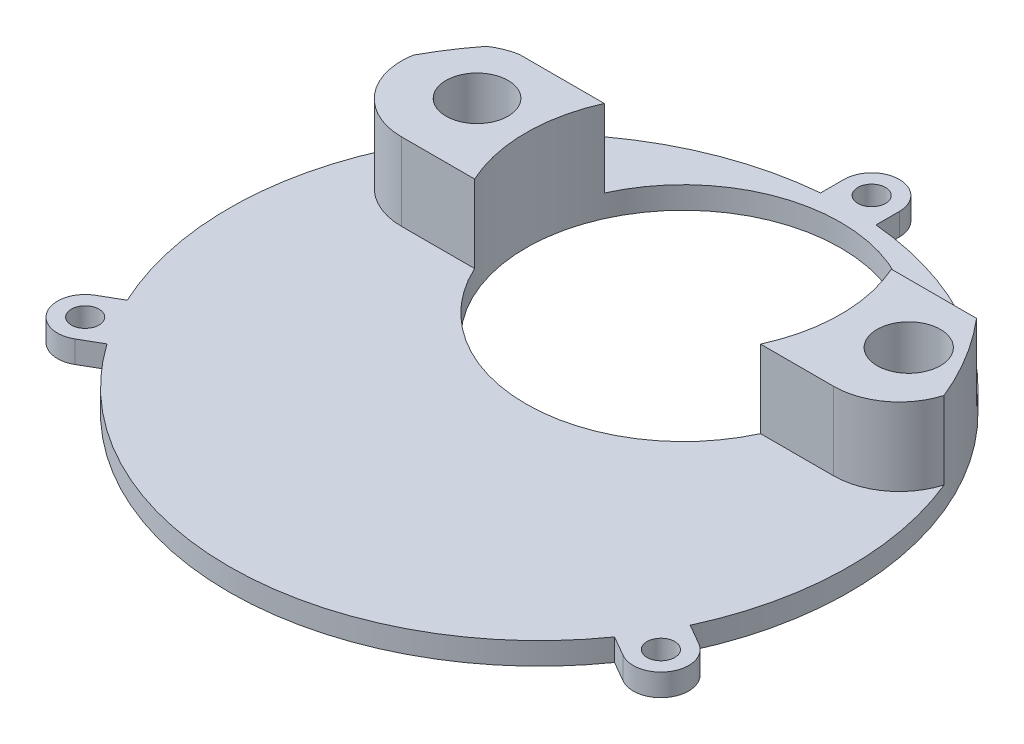
ISO-10303-21;
HEADER;
FILE_DESCRIPTION(('STEP AP214'),'2;1');
FILE_NAME('part.step','',(''),(''),'','','');
FILE_SCHEMA(('AUTOMOTIVE_DESIGN { 1 0 10303 214 1 1 1 1 }'));
ENDSEC;
DATA;
#1=APPLICATION_CONTEXT('core data for automotive mechanical design processes');
#2=APPLICATION_PROTOCOL_DEFINITION('international standard','automotive_design',2000,#1);
#3=PRODUCT_CONTEXT('',#1,'mechanical');
#4=PRODUCT('Part','Part','',(#3));
#5=PRODUCT_RELATED_PRODUCT_CATEGORY('part','',(#4));
#6=PRODUCT_DEFINITION_FORMATION('','',#4);
#7=PRODUCT_DEFINITION_CONTEXT('part definition',#1,'design');
#8=PRODUCT_DEFINITION('design','',#6,#7);
#9=PRODUCT_DEFINITION_SHAPE('','',#8);
#10=(LENGTH_UNIT() NAMED_UNIT(*) SI_UNIT(.MILLI.,.METRE.));
#11=(NAMED_UNIT(*) PLANE_ANGLE_UNIT() SI_UNIT($,.RADIAN.));
#12=(NAMED_UNIT(*) SI_UNIT($,.STERADIAN.) SOLID_ANGLE_UNIT());
#13=UNCERTAINTY_MEASURE_WITH_UNIT(LENGTH_MEASURE(1.E-05),#10,'distance_accuracy_value','');
#14=(GEOMETRIC_REPRESENTATION_CONTEXT(3) GLOBAL_UNCERTAINTY_ASSIGNED_CONTEXT((#13)) GLOBAL_UNIT_ASSIGNED_CONTEXT((#10,
#11,#12)) REPRESENTATION_CONTEXT('',''));
#15=CARTESIAN_POINT('',(0.,0.,0.));
#16=DIRECTION('',(0.,0.,1.));
#17=DIRECTION('',(1.,0.,0.));
#18=AXIS2_PLACEMENT_3D('',#15,#16,#17);
#19=CARTESIAN_POINT('',(0.,9.,0.));
#20=DIRECTION('',(0.,-1.,0.));
#21=DIRECTION('',(0.,0.,-1.));
#22=AXIS2_PLACEMENT_3D('',#19,#20,#21);
#23=PLANE('',#22);
#24=CARTESIAN_POINT('',(20.562204280921,9.,-12.7828628885567));
#25=DIRECTION('',(0.,1.,0.));
#26=DIRECTION('',(0.,0.,1.));
#27=AXIS2_PLACEMENT_3D('',#24,#25,#26);
#28=CIRCLE('',#27,2.85);
#29=CARTESIAN_POINT('',(20.562204280921,9.,-9.93286288855668));
#30=VERTEX_POINT('',#29);
#31=EDGE_CURVE('E503',#30,#30,#28,.T.);
#32=ORIENTED_EDGE('',*,*,#31,.F.);
#33=EDGE_LOOP('',(#32));
#34=FACE_BOUND('',#33,.T.);
#35=DIRECTION('',(-1.,0.,0.));
#36=VECTOR('',#35,1.);
#37=CARTESIAN_POINT('',(-19.9430979494863,9.,-18.1238011994917));
#38=LINE('',#37,#36);
#39=CARTESIAN_POINT('',(21.3430979494863,9.,-18.1238011994917));
#40=VERTEX_POINT('',#39);
#41=CARTESIAN_POINT('',(13.6508045923327,9.00000000000001,-18.1238011994917));
#42=VERTEX_POINT('',#41);
#43=EDGE_CURVE('E201',#40,#42,#38,.T.);
#44=ORIENTED_EDGE('',*,*,#43,.T.);
#45=CARTESIAN_POINT('',(0.699999999999999,9.00000000000001,-12.2999999999989));
#46=DIRECTION('',(0.,-1.,0.));
#47=DIRECTION('',(0.,0.,-1.));
#48=AXIS2_PLACEMENT_3D('',#45,#46,#47);
#49=CIRCLE('',#48,14.2);
#50=CARTESIAN_POINT('',(13.6002583953449,9.00000000000001,-6.36507511982282));
#51=VERTEX_POINT('',#50);
#52=EDGE_CURVE('E187',#42,#51,#49,.T.);
#53=ORIENTED_EDGE('',*,*,#52,.T.);
#54=DIRECTION('',(1.,0.,0.));
#55=VECTOR('',#54,1.);
#56=CARTESIAN_POINT('',(20.2,9.,-6.36507511982282));
#57=LINE('',#56,#55);
#58=CARTESIAN_POINT('',(20.2,9.,-6.36507511982282));
#59=VERTEX_POINT('',#58);
#60=EDGE_CURVE('E220',#51,#59,#57,.T.);
#61=ORIENTED_EDGE('',*,*,#60,.T.);
#62=CARTESIAN_POINT('',(20.2,9.,-12.2999999999989));
#63=DIRECTION('',(0.,1.,0.));
#64=DIRECTION('',(0.,0.,-1.));
#65=AXIS2_PLACEMENT_3D('',#62,#63,#64);
#66=CIRCLE('',#65,5.93492488017609);
#67=CARTESIAN_POINT('',(25.8986996774399,9.,-10.6422438901688));
#68=VERTEX_POINT('',#67);
#69=EDGE_CURVE('E224',#59,#68,#66,.T.);
#70=ORIENTED_EDGE('',*,*,#69,.T.);
#71=CARTESIAN_POINT('',(0.,9.,0.));
#72=DIRECTION('',(0.,1.,0.));
#73=DIRECTION('',(0.,0.,-1.));
#74=AXIS2_PLACEMENT_3D('',#71,#72,#73);
#75=CIRCLE('',#74,28.0000000000011);
#76=EDGE_CURVE('E207',#68,#40,#75,.T.);
#77=ORIENTED_EDGE('',*,*,#76,.T.);
#78=EDGE_LOOP('',(#44,#53,#61,#70,#77));
#79=FACE_BOUND('',#78,.T.);
#80=ADVANCED_FACE('F33',(#34,#79),#23,.F.);
#81=CARTESIAN_POINT('',(-19.9430979494863,9.,-18.1238011994917));
#82=DIRECTION('',(0.,0.,1.));
#83=DIRECTION('',(1.,0.,0.));
#84=AXIS2_PLACEMENT_3D('',#81,#82,#83);
#85=PLANE('',#84);
#86=CARTESIAN_POINT('',(-12.2508045923327,9.00000000000001,-18.1238011994917));
#87=VERTEX_POINT('',#86);
#88=CARTESIAN_POINT('',(-19.9430979494863,9.,-18.1238011994917));
#89=VERTEX_POINT('',#88);
#90=EDGE_CURVE('E210',#87,#89,#38,.T.);
#91=ORIENTED_EDGE('',*,*,#90,.F.);
#92=DIRECTION('',(0.,-1.,0.));
#93=VECTOR('',#92,1.);
#94=CARTESIAN_POINT('',(-12.2508045923327,0.,-18.1238011994917));
#95=LINE('',#94,#93);
#96=CARTESIAN_POINT('',(-12.2508045923327,2.,-18.1238011994917));
#97=VERTEX_POINT('',#96);
#98=EDGE_CURVE('E420',#87,#97,#95,.T.);
#99=ORIENTED_EDGE('',*,*,#98,.T.);
#100=DIRECTION('',(-1.,0.,0.));
#101=VECTOR('',#100,1.);
#102=CARTESIAN_POINT('',(-19.9430979494863,2.,-18.1238011994917));
#103=LINE('',#102,#101);
#104=CARTESIAN_POINT('',(-19.9430979494863,2.,-18.1238011994917));
#105=VERTEX_POINT('',#104);
#106=EDGE_CURVE('E229',#97,#105,#103,.T.);
#107=ORIENTED_EDGE('',*,*,#106,.T.);
#108=DIRECTION('',(0.,-1.,0.));
#109=VECTOR('',#108,1.);
#110=CARTESIAN_POINT('',(-19.9430979494863,9.,-18.1238011994917));
#111=LINE('',#110,#109);
#112=EDGE_CURVE('E255',#89,#105,#111,.T.);
#113=ORIENTED_EDGE('',*,*,#112,.F.);
#114=EDGE_LOOP('',(#91,#99,#107,#113));
#115=FACE_BOUND('',#114,.T.);
#116=ADVANCED_FACE('F445',(#115),#85,.F.);
#117=CARTESIAN_POINT('',(20.2,9.,-6.36507511982282));
#118=DIRECTION('',(0.,0.,-1.));
#119=DIRECTION('',(-1.,0.,0.));
#120=AXIS2_PLACEMENT_3D('',#117,#118,#119);
#121=PLANE('',#120);
#122=ORIENTED_EDGE('',*,*,#60,.F.);
#123=DIRECTION('',(0.,-1.,0.));
#124=VECTOR('',#123,1.);
#125=CARTESIAN_POINT('',(13.6002583953449,0.,-6.36507511982282));
#126=LINE('',#125,#124);
#127=CARTESIAN_POINT('',(13.6002583953449,2.,-6.36507511982282));
#128=VERTEX_POINT('',#127);
#129=EDGE_CURVE('E11',#51,#128,#126,.T.);
#130=ORIENTED_EDGE('',*,*,#129,.T.);
#131=DIRECTION('',(1.,0.,0.));
#132=VECTOR('',#131,1.);
#133=CARTESIAN_POINT('',(20.2,2.,-6.36507511982282));
#134=LINE('',#133,#132);
#135=CARTESIAN_POINT('',(20.2,2.,-6.36507511982282));
#136=VERTEX_POINT('',#135);
#137=EDGE_CURVE('E55',#128,#136,#134,.T.);
#138=ORIENTED_EDGE('',*,*,#137,.T.);
#139=DIRECTION('',(0.,-1.,0.));
#140=VECTOR('',#139,1.);
#141=CARTESIAN_POINT('',(20.2,9.,-6.36507511982282));
#142=LINE('',#141,#140);
#143=EDGE_CURVE('E243',#59,#136,#142,.T.);
#144=ORIENTED_EDGE('',*,*,#143,.F.);
#145=EDGE_LOOP('',(#122,#130,#138,#144));
#146=FACE_BOUND('',#145,.T.);
#147=ADVANCED_FACE('F478',(#146),#121,.F.);
#148=CARTESIAN_POINT('',(0.,2.,0.));
#149=DIRECTION('',(0.,1.,0.));
#150=DIRECTION('',(0.,0.,1.));
#151=AXIS2_PLACEMENT_3D('',#148,#149,#150);
#152=PLANE('',#151);
#153=CARTESIAN_POINT('',(0.699999999999999,2.,-12.2999999999989));
#154=DIRECTION('',(0.,1.,0.));
#155=DIRECTION('',(0.,0.,1.));
#156=AXIS2_PLACEMENT_3D('',#153,#154,#155);
#157=CIRCLE('',#156,14.2);
#158=CARTESIAN_POINT('',(-12.2002583953449,2.,-6.36507511982283));
#159=VERTEX_POINT('',#158);
#160=EDGE_CURVE('E195',#159,#128,#157,.T.);
#161=ORIENTED_EDGE('',*,*,#160,.F.);
#162=CARTESIAN_POINT('',(-18.8,2.,-6.36507511982283));
#163=VERTEX_POINT('',#162);
#164=EDGE_CURVE('E235',#163,#159,#134,.T.);
#165=ORIENTED_EDGE('',*,*,#164,.F.);
#166=CARTESIAN_POINT('',(-18.8,2.,-12.2999999999989));
#167=DIRECTION('',(0.,1.,0.));
#168=DIRECTION('',(0.,0.,-1.));
#169=AXIS2_PLACEMENT_3D('',#166,#167,#168);
#170=CIRCLE('',#169,5.93492488017609);
#171=CARTESIAN_POINT('',(-24.6548300294337,2.,-13.2717503073181));
#172=VERTEX_POINT('',#171);
#173=EDGE_CURVE('E232',#172,#163,#170,.T.);
#174=ORIENTED_EDGE('',*,*,#173,.F.);
#175=CARTESIAN_POINT('',(0.,2.,0.));
#176=DIRECTION('',(0.,1.,0.));
#177=DIRECTION('',(0.,0.,1.));
#178=AXIS2_PLACEMENT_3D('',#175,#176,#177);
#179=CIRCLE('',#178,28.0000000000011);
#180=CARTESIAN_POINT('',(-25.4018632821574,2.,11.7790212579248));
#181=VERTEX_POINT('',#180);
#182=EDGE_CURVE('E260',#172,#181,#179,.T.);
#183=ORIENTED_EDGE('',*,*,#182,.T.);
#184=DIRECTION('',(-0.866025403784438,0.,0.5));
#185=VECTOR('',#184,1.);
#186=CARTESIAN_POINT('',(-25.4018632821574,2.,11.7790212579248));
#187=LINE('',#186,#185);
#188=CARTESIAN_POINT('',(-27.2307621135325,2.,12.8349364905398));
#189=VERTEX_POINT('',#188);
#190=EDGE_CURVE('E301',#181,#189,#187,.T.);
#191=ORIENTED_EDGE('',*,*,#190,.T.);
#192=CARTESIAN_POINT('',(-25.9807621135325,2.,15.0000000000009));
#193=DIRECTION('',(0.,1.,0.));
#194=DIRECTION('',(0.,0.,1.));
#195=AXIS2_PLACEMENT_3D('',#192,#193,#194);
#196=CIRCLE('',#195,2.50000000000002);
#197=CARTESIAN_POINT('',(-24.7307621135325,2.,17.165063509462));
#198=VERTEX_POINT('',#197);
#199=EDGE_CURVE('E304',#189,#198,#196,.T.);
#200=ORIENTED_EDGE('',*,*,#199,.T.);
#201=DIRECTION('',(0.86602540378444,0.,-0.499999999999998));
#202=VECTOR('',#201,1.);
#203=CARTESIAN_POINT('',(-24.7307621135325,2.,17.165063509462));
#204=LINE('',#203,#202);
#205=CARTESIAN_POINT('',(-22.9018632821572,2.,16.1091482768469));
#206=VERTEX_POINT('',#205);
#207=EDGE_CURVE('E307',#198,#206,#204,.T.);
#208=ORIENTED_EDGE('',*,*,#207,.T.);
#209=CARTESIAN_POINT('',(0.,2.,0.));
#210=DIRECTION('',(0.,1.,0.));
#211=DIRECTION('',(0.,0.,1.));
#212=AXIS2_PLACEMENT_3D('',#209,#210,#211);
#213=CIRCLE('',#212,28.000000000001);
#214=CARTESIAN_POINT('',(22.9018632821586,2.,16.1091482768449));
#215=VERTEX_POINT('',#214);
#216=EDGE_CURVE('E310',#206,#215,#213,.T.);
#217=ORIENTED_EDGE('',*,*,#216,.T.);
#218=DIRECTION('',(0.866025403784441,0.,0.499999999999997));
#219=VECTOR('',#218,1.);
#220=CARTESIAN_POINT('',(22.9018632821586,2.,16.1091482768449));
#221=LINE('',#220,#219);
#222=CARTESIAN_POINT('',(24.7307621135337,2.,17.1650635094599));
#223=VERTEX_POINT('',#222);
#224=EDGE_CURVE('E313',#215,#223,#221,.T.);
#225=ORIENTED_EDGE('',*,*,#224,.T.);
#226=CARTESIAN_POINT('',(25.9807621135337,2.,14.9999999999988));
#227=DIRECTION('',(0.,1.,0.));
#228=DIRECTION('',(0.,0.,1.));
#229=AXIS2_PLACEMENT_3D('',#226,#227,#228);
#230=CIRCLE('',#229,2.50000000000001);
#231=CARTESIAN_POINT('',(27.2307621135337,2.,12.8349364905377));
#232=VERTEX_POINT('',#231);
#233=EDGE_CURVE('E316',#223,#232,#230,.T.);
#234=ORIENTED_EDGE('',*,*,#233,.T.);
#235=DIRECTION('',(-0.866025403784436,0.,-0.500000000000004));
#236=VECTOR('',#235,1.);
#237=CARTESIAN_POINT('',(27.2307621135337,2.,12.8349364905377));
#238=LINE('',#237,#236);
#239=CARTESIAN_POINT('',(25.4018632821585,2.,11.7790212579226));
#240=VERTEX_POINT('',#239);
#241=EDGE_CURVE('E319',#232,#240,#238,.T.);
#242=ORIENTED_EDGE('',*,*,#241,.T.);
#243=CARTESIAN_POINT('',(0.,2.,0.));
#244=DIRECTION('',(0.,1.,0.));
#245=DIRECTION('',(0.,0.,1.));
#246=AXIS2_PLACEMENT_3D('',#243,#244,#245);
#247=CIRCLE('',#246,28.0000000000011);
#248=CARTESIAN_POINT('',(25.89869967744,2.,-10.6422438901688));
#249=VERTEX_POINT('',#248);
#250=EDGE_CURVE('E323',#240,#249,#247,.T.);
#251=ORIENTED_EDGE('',*,*,#250,.T.);
#252=CARTESIAN_POINT('',(20.2,2.,-12.2999999999989));
#253=DIRECTION('',(0.,1.,0.));
#254=DIRECTION('',(0.,0.,-1.));
#255=AXIS2_PLACEMENT_3D('',#252,#253,#254);
#256=CIRCLE('',#255,5.93492488017609);
#257=EDGE_CURVE('E238',#136,#249,#256,.T.);
#258=ORIENTED_EDGE('',*,*,#257,.F.);
#259=ORIENTED_EDGE('',*,*,#137,.F.);
#260=EDGE_LOOP('',(#161,#165,#174,#183,#191,#200,#208,#217,#225,#234,#242,#251,#258,#259));
#261=FACE_BOUND('',#260,.T.);
#262=CARTESIAN_POINT('',(-25.9807621135325,2.,15.0000000000009));
#263=DIRECTION('',(0.,1.,0.));
#264=DIRECTION('',(0.,0.,1.));
#265=AXIS2_PLACEMENT_3D('',#262,#263,#264);
#266=CIRCLE('',#265,1.25000000000137);
#267=CARTESIAN_POINT('',(-25.9807621135325,2.,16.2500000000023));
#268=VERTEX_POINT('',#267);
#269=EDGE_CURVE('E422',#268,#268,#266,.T.);
#270=ORIENTED_EDGE('',*,*,#269,.F.);
#271=EDGE_LOOP('',(#270));
#272=FACE_BOUND('',#271,.T.);
#273=CARTESIAN_POINT('',(25.9807621135337,2.,14.9999999999988));
#274=DIRECTION('',(0.,1.,0.));
#275=DIRECTION('',(0.,0.,1.));
#276=AXIS2_PLACEMENT_3D('',#273,#274,#275);
#277=CIRCLE('',#276,1.25000000000137);
#278=CARTESIAN_POINT('',(25.9807621135337,2.,16.2500000000002));
#279=VERTEX_POINT('',#278);
#280=EDGE_CURVE('E431',#279,#279,#277,.T.);
#281=ORIENTED_EDGE('',*,*,#280,.F.);
#282=EDGE_LOOP('',(#281));
#283=FACE_BOUND('',#282,.T.);
#284=ADVANCED_FACE('F372',(#261,#272,#283),#152,.T.);
#285=CARTESIAN_POINT('',(0.,0.,0.));
#286=DIRECTION('',(0.,1.,0.));
#287=DIRECTION('',(0.,0.,1.));
#288=AXIS2_PLACEMENT_3D('',#285,#286,#287);
#289=CYLINDRICAL_SURFACE('',#288,28.0000000000011);
#290=CARTESIAN_POINT('',(-2.50000000000121,2.,-27.8881695347697));
#291=VERTEX_POINT('',#290);
#292=CARTESIAN_POINT('',(-22.0353317072082,2.,-17.2755363608013));
#293=VERTEX_POINT('',#292);
#294=EDGE_CURVE('E299',#291,#293,#179,.T.);
#295=ORIENTED_EDGE('',*,*,#294,.F.);
#296=DIRECTION('',(0.,1.,0.));
#297=VECTOR('',#296,1.);
#298=CARTESIAN_POINT('',(-2.50000000000121,0.,-27.8881695347697));
#299=LINE('',#298,#297);
#300=CARTESIAN_POINT('',(-2.50000000000121,0.,-27.8881695347697));
#301=VERTEX_POINT('',#300);
#302=EDGE_CURVE('E333',#301,#291,#299,.T.);
#303=ORIENTED_EDGE('',*,*,#302,.F.);
#304=CARTESIAN_POINT('',(0.,0.,0.));
#305=DIRECTION('',(0.,1.,0.));
#306=DIRECTION('',(0.,0.,1.));
#307=AXIS2_PLACEMENT_3D('',#304,#305,#306);
#308=CIRCLE('',#307,28.0000000000011);
#309=CARTESIAN_POINT('',(-25.4018632821574,0.,11.7790212579248));
#310=VERTEX_POINT('',#309);
#311=EDGE_CURVE('E261',#301,#310,#308,.T.);
#312=ORIENTED_EDGE('',*,*,#311,.T.);
#313=DIRECTION('',(0.,1.,0.));
#314=VECTOR('',#313,1.);
#315=CARTESIAN_POINT('',(-25.4018632821574,0.,11.7790212579248));
#316=LINE('',#315,#314);
#317=EDGE_CURVE('E298',#310,#181,#316,.T.);
#318=ORIENTED_EDGE('',*,*,#317,.T.);
#319=ORIENTED_EDGE('',*,*,#182,.F.);
#320=DIRECTION('',(0.,-1.,0.));
#321=VECTOR('',#320,1.);
#322=CARTESIAN_POINT('',(-24.6548300294337,9.,-13.2717503073181));
#323=LINE('',#322,#321);
#324=CARTESIAN_POINT('',(-24.6548300294337,9.,-13.2717503073181));
#325=VERTEX_POINT('',#324);
#326=EDGE_CURVE('E249',#325,#172,#323,.T.);
#327=ORIENTED_EDGE('',*,*,#326,.F.);
#328=CARTESIAN_POINT('',(0.,9.,0.));
#329=DIRECTION('',(0.,1.,0.));
#330=DIRECTION('',(0.,0.,-1.));
#331=AXIS2_PLACEMENT_3D('',#328,#329,#330);
#332=CIRCLE('',#331,28.0000000000011);
#333=CARTESIAN_POINT('',(-22.0353317072083,9.,-17.2755363608012));
#334=VERTEX_POINT('',#333);
#335=EDGE_CURVE('E212',#334,#325,#332,.T.);
#336=ORIENTED_EDGE('',*,*,#335,.F.);
#337=DIRECTION('',(0.,-1.,0.));
#338=VECTOR('',#337,1.);
#339=CARTESIAN_POINT('',(-22.0353317072083,9.,-17.2755363608012));
#340=LINE('',#339,#338);
#341=EDGE_CURVE('E252',#334,#293,#340,.T.);
#342=ORIENTED_EDGE('',*,*,#341,.T.);
#343=EDGE_LOOP('',(#295,#303,#312,#318,#319,#327,#336,#342));
#344=FACE_BOUND('',#343,.T.);
#345=ADVANCED_FACE('F35',(#344),#289,.T.);
#346=CARTESIAN_POINT('',(-2.5000000000012,0.,-30.));
#347=DIRECTION('',(-1.,0.,0.));
#348=DIRECTION('',(0.,0.,1.));
#349=AXIS2_PLACEMENT_3D('',#346,#347,#348);
#350=PLANE('',#349);
#351=DIRECTION('',(0.,0.,1.));
#352=VECTOR('',#351,1.);
#353=CARTESIAN_POINT('',(-2.5000000000012,2.,-30.));
#354=LINE('',#353,#352);
#355=CARTESIAN_POINT('',(-2.5000000000012,2.,-30.));
#356=VERTEX_POINT('',#355);
#357=EDGE_CURVE('E265',#356,#291,#354,.T.);
#358=ORIENTED_EDGE('',*,*,#357,.F.);
#359=DIRECTION('',(0.,1.,0.));
#360=VECTOR('',#359,1.);
#361=CARTESIAN_POINT('',(-2.5000000000012,0.,-30.));
#362=LINE('',#361,#360);
#363=CARTESIAN_POINT('',(-2.5000000000012,0.,-30.));
#364=VERTEX_POINT('',#363);
#365=EDGE_CURVE('E335',#364,#356,#362,.T.);
#366=ORIENTED_EDGE('',*,*,#365,.F.);
#367=DIRECTION('',(0.,0.,1.));
#368=VECTOR('',#367,1.);
#369=CARTESIAN_POINT('',(-2.5000000000012,0.,-30.));
#370=LINE('',#369,#368);
#371=EDGE_CURVE('E295',#364,#301,#370,.T.);
#372=ORIENTED_EDGE('',*,*,#371,.T.);
#373=ORIENTED_EDGE('',*,*,#302,.T.);
#374=EDGE_LOOP('',(#358,#366,#372,#373));
#375=FACE_BOUND('',#374,.T.);
#376=ADVANCED_FACE('F453',(#375),#350,.T.);
#377=CARTESIAN_POINT('',(-1.19722997869874E-12,0.,-30.));
#378=DIRECTION('',(0.,1.,0.));
#379=DIRECTION('',(0.,0.,1.));
#380=AXIS2_PLACEMENT_3D('',#377,#378,#379);
#381=CYLINDRICAL_SURFACE('',#380,2.50000000000001);
#382=CARTESIAN_POINT('',(-1.19722997869874E-12,2.,-30.));
#383=DIRECTION('',(0.,1.,0.));
#384=DIRECTION('',(0.,0.,1.));
#385=AXIS2_PLACEMENT_3D('',#382,#383,#384);
#386=CIRCLE('',#385,2.50000000000001);
#387=CARTESIAN_POINT('',(2.49999999999881,2.,-30.));
#388=VERTEX_POINT('',#387);
#389=EDGE_CURVE('E328',#388,#356,#386,.T.);
#390=ORIENTED_EDGE('',*,*,#389,.F.);
#391=DIRECTION('',(0.,1.,0.));
#392=VECTOR('',#391,1.);
#393=CARTESIAN_POINT('',(2.49999999999881,0.,-30.));
#394=LINE('',#393,#392);
#395=CARTESIAN_POINT('',(2.49999999999881,0.,-30.));
#396=VERTEX_POINT('',#395);
#397=EDGE_CURVE('E337',#396,#388,#394,.T.);
#398=ORIENTED_EDGE('',*,*,#397,.F.);
#399=CARTESIAN_POINT('',(-1.19722997869874E-12,0.,-30.));
#400=DIRECTION('',(0.,1.,0.));
#401=DIRECTION('',(0.,0.,1.));
#402=AXIS2_PLACEMENT_3D('',#399,#400,#401);
#403=CIRCLE('',#402,2.50000000000001);
#404=EDGE_CURVE('E292',#396,#364,#403,.T.);
#405=ORIENTED_EDGE('',*,*,#404,.T.);
#406=ORIENTED_EDGE('',*,*,#365,.T.);
#407=EDGE_LOOP('',(#390,#398,#405,#406));
#408=FACE_BOUND('',#407,.T.);
#409=ADVANCED_FACE('F463',(#408),#381,.T.);
#410=CARTESIAN_POINT('',(2.49999999999883,0.,-27.88816953477));
#411=DIRECTION('',(1.,0.,0.));
#412=DIRECTION('',(0.,0.,-1.));
#413=AXIS2_PLACEMENT_3D('',#410,#411,#412);
#414=PLANE('',#413);
#415=DIRECTION('',(0.,0.,-1.));
#416=VECTOR('',#415,1.);
#417=CARTESIAN_POINT('',(2.49999999999883,2.,-27.88816953477));
#418=LINE('',#417,#416);
#419=CARTESIAN_POINT('',(2.49999999999883,2.,-27.88816953477));
#420=VERTEX_POINT('',#419);
#421=EDGE_CURVE('E325',#420,#388,#418,.T.);
#422=ORIENTED_EDGE('',*,*,#421,.F.);
#423=DIRECTION('',(0.,1.,0.));
#424=VECTOR('',#423,1.);
#425=CARTESIAN_POINT('',(2.49999999999883,0.,-27.88816953477));
#426=LINE('',#425,#424);
#427=CARTESIAN_POINT('',(2.49999999999883,0.,-27.88816953477));
#428=VERTEX_POINT('',#427);
#429=EDGE_CURVE('E339',#428,#420,#426,.T.);
#430=ORIENTED_EDGE('',*,*,#429,.F.);
#431=DIRECTION('',(0.,0.,-1.));
#432=VECTOR('',#431,1.);
#433=CARTESIAN_POINT('',(2.49999999999883,0.,-27.88816953477));
#434=LINE('',#433,#432);
#435=EDGE_CURVE('E289',#428,#396,#434,.T.);
#436=ORIENTED_EDGE('',*,*,#435,.T.);
#437=ORIENTED_EDGE('',*,*,#397,.T.);
#438=EDGE_LOOP('',(#422,#430,#436,#437));
#439=FACE_BOUND('',#438,.T.);
#440=ADVANCED_FACE('F461',(#439),#414,.T.);
#441=CARTESIAN_POINT('',(0.,0.,0.));
#442=DIRECTION('',(0.,1.,0.));
#443=DIRECTION('',(0.,0.,1.));
#444=AXIS2_PLACEMENT_3D('',#441,#442,#443);
#445=CYLINDRICAL_SURFACE('',#444,28.0000000000011);
#446=ORIENTED_EDGE('',*,*,#250,.F.);
#447=DIRECTION('',(0.,1.,0.));
#448=VECTOR('',#447,1.);
#449=CARTESIAN_POINT('',(25.4018632821585,0.,11.7790212579226));
#450=LINE('',#449,#448);
#451=CARTESIAN_POINT('',(25.4018632821585,0.,11.7790212579226));
#452=VERTEX_POINT('',#451);
#453=EDGE_CURVE('E342',#452,#240,#450,.T.);
#454=ORIENTED_EDGE('',*,*,#453,.F.);
#455=CARTESIAN_POINT('',(0.,0.,0.));
#456=DIRECTION('',(0.,1.,0.));
#457=DIRECTION('',(0.,0.,1.));
#458=AXIS2_PLACEMENT_3D('',#455,#456,#457);
#459=CIRCLE('',#458,28.0000000000011);
#460=EDGE_CURVE('E286',#452,#428,#459,.T.);
#461=ORIENTED_EDGE('',*,*,#460,.T.);
#462=ORIENTED_EDGE('',*,*,#429,.T.);
#463=CARTESIAN_POINT('',(21.3430979494864,2.,-18.1238011994917));
#464=VERTEX_POINT('',#463);
#465=EDGE_CURVE('E322',#464,#420,#247,.T.);
#466=ORIENTED_EDGE('',*,*,#465,.F.);
#467=DIRECTION('',(0.,-1.,0.));
#468=VECTOR('',#467,1.);
#469=CARTESIAN_POINT('',(21.3430979494863,9.,-18.1238011994917));
#470=LINE('',#469,#468);
#471=EDGE_CURVE('E258',#40,#464,#470,.T.);
#472=ORIENTED_EDGE('',*,*,#471,.F.);
#473=ORIENTED_EDGE('',*,*,#76,.F.);
#474=DIRECTION('',(0.,-1.,0.));
#475=VECTOR('',#474,1.);
#476=CARTESIAN_POINT('',(25.8986996774399,9.,-10.6422438901688));
#477=LINE('',#476,#475);
#478=EDGE_CURVE('E226',#68,#249,#477,.T.);
#479=ORIENTED_EDGE('',*,*,#478,.T.);
#480=EDGE_LOOP('',(#446,#454,#461,#462,#466,#472,#473,#479));
#481=FACE_BOUND('',#480,.T.);
#482=ADVANCED_FACE('F411',(#481),#445,.T.);
#483=CARTESIAN_POINT('',(27.2307621135337,0.,12.8349364905377));
#484=DIRECTION('',(0.500000000000004,0.,-0.866025403784436));
#485=DIRECTION('',(-0.866025403784436,0.,-0.500000000000004));
#486=AXIS2_PLACEMENT_3D('',#483,#484,#485);
#487=PLANE('',#486);
#488=ORIENTED_EDGE('',*,*,#241,.F.);
#489=DIRECTION('',(0.,1.,0.));
#490=VECTOR('',#489,1.);
#491=CARTESIAN_POINT('',(27.2307621135337,0.,12.8349364905377));
#492=LINE('',#491,#490);
#493=CARTESIAN_POINT('',(27.2307621135337,0.,12.8349364905377));
#494=VERTEX_POINT('',#493);
#495=EDGE_CURVE('E344',#494,#232,#492,.T.);
#496=ORIENTED_EDGE('',*,*,#495,.F.);
#497=DIRECTION('',(-0.866025403784436,0.,-0.500000000000004));
#498=VECTOR('',#497,1.);
#499=CARTESIAN_POINT('',(27.2307621135337,0.,12.8349364905377));
#500=LINE('',#499,#498);
#501=EDGE_CURVE('E283',#494,#452,#500,.T.);
#502=ORIENTED_EDGE('',*,*,#501,.T.);
#503=ORIENTED_EDGE('',*,*,#453,.T.);
#504=EDGE_LOOP('',(#488,#496,#502,#503));
#505=FACE_BOUND('',#504,.T.);
#506=ADVANCED_FACE('F404',(#505),#487,.T.);
#507=CARTESIAN_POINT('',(25.9807621135337,0.,14.9999999999988));
#508=DIRECTION('',(0.,1.,0.));
#509=DIRECTION('',(0.,0.,1.));
#510=AXIS2_PLACEMENT_3D('',#507,#508,#509);
#511=CYLINDRICAL_SURFACE('',#510,2.50000000000001);
#512=ORIENTED_EDGE('',*,*,#233,.F.);
#513=DIRECTION('',(0.,1.,0.));
#514=VECTOR('',#513,1.);
#515=CARTESIAN_POINT('',(24.7307621135337,0.,17.1650635094599));
#516=LINE('',#515,#514);
#517=CARTESIAN_POINT('',(24.7307621135337,0.,17.1650635094599));
#518=VERTEX_POINT('',#517);
#519=EDGE_CURVE('E346',#518,#223,#516,.T.);
#520=ORIENTED_EDGE('',*,*,#519,.F.);
#521=CARTESIAN_POINT('',(25.9807621135337,0.,14.9999999999988));
#522=DIRECTION('',(0.,1.,0.));
#523=DIRECTION('',(0.,0.,1.));
#524=AXIS2_PLACEMENT_3D('',#521,#522,#523);
#525=CIRCLE('',#524,2.50000000000001);
#526=EDGE_CURVE('E280',#518,#494,#525,.T.);
#527=ORIENTED_EDGE('',*,*,#526,.T.);
#528=ORIENTED_EDGE('',*,*,#495,.T.);
#529=EDGE_LOOP('',(#512,#520,#527,#528));
#530=FACE_BOUND('',#529,.T.);
#531=ADVANCED_FACE('F400',(#530),#511,.T.);
#532=CARTESIAN_POINT('',(22.9018632821586,0.,16.1091482768449));
#533=DIRECTION('',(-0.499999999999997,0.,0.866025403784441));
#534=DIRECTION('',(0.866025403784441,0.,0.499999999999997));
#535=AXIS2_PLACEMENT_3D('',#532,#533,#534);
#536=PLANE('',#535);
#537=ORIENTED_EDGE('',*,*,#224,.F.);
#538=DIRECTION('',(0.,1.,0.));
#539=VECTOR('',#538,1.);
#540=CARTESIAN_POINT('',(22.9018632821586,0.,16.1091482768449));
#541=LINE('',#540,#539);
#542=CARTESIAN_POINT('',(22.9018632821586,0.,16.1091482768449));
#543=VERTEX_POINT('',#542);
#544=EDGE_CURVE('E348',#543,#215,#541,.T.);
#545=ORIENTED_EDGE('',*,*,#544,.F.);
#546=DIRECTION('',(0.866025403784441,0.,0.499999999999997));
#547=VECTOR('',#546,1.);
#548=CARTESIAN_POINT('',(22.9018632821586,0.,16.1091482768449));
#549=LINE('',#548,#547);
#550=EDGE_CURVE('E277',#543,#518,#549,.T.);
#551=ORIENTED_EDGE('',*,*,#550,.T.);
#552=ORIENTED_EDGE('',*,*,#519,.T.);
#553=EDGE_LOOP('',(#537,#545,#551,#552));
#554=FACE_BOUND('',#553,.T.);
#555=ADVANCED_FACE('F396',(#554),#536,.T.);
#556=CARTESIAN_POINT('',(0.,0.,0.));
#557=DIRECTION('',(0.,1.,0.));
#558=DIRECTION('',(0.,0.,1.));
#559=AXIS2_PLACEMENT_3D('',#556,#557,#558);
#560=CYLINDRICAL_SURFACE('',#559,28.000000000001);
#561=ORIENTED_EDGE('',*,*,#216,.F.);
#562=DIRECTION('',(0.,1.,0.));
#563=VECTOR('',#562,1.);
#564=CARTESIAN_POINT('',(-22.9018632821572,0.,16.1091482768469));
#565=LINE('',#564,#563);
#566=CARTESIAN_POINT('',(-22.9018632821572,0.,16.1091482768469));
#567=VERTEX_POINT('',#566);
#568=EDGE_CURVE('E350',#567,#206,#565,.T.);
#569=ORIENTED_EDGE('',*,*,#568,.F.);
#570=CARTESIAN_POINT('',(0.,0.,0.));
#571=DIRECTION('',(0.,1.,0.));
#572=DIRECTION('',(0.,0.,1.));
#573=AXIS2_PLACEMENT_3D('',#570,#571,#572);
#574=CIRCLE('',#573,28.000000000001);
#575=EDGE_CURVE('E274',#567,#543,#574,.T.);
#576=ORIENTED_EDGE('',*,*,#575,.T.);
#577=ORIENTED_EDGE('',*,*,#544,.T.);
#578=EDGE_LOOP('',(#561,#569,#576,#577));
#579=FACE_BOUND('',#578,.T.);
#580=ADVANCED_FACE('F392',(#579),#560,.T.);
#581=CARTESIAN_POINT('',(-24.7307621135325,0.,17.165063509462));
#582=DIRECTION('',(0.499999999999998,0.,0.86602540378444));
#583=DIRECTION('',(0.86602540378444,0.,-0.499999999999998));
#584=AXIS2_PLACEMENT_3D('',#581,#582,#583);
#585=PLANE('',#584);
#586=ORIENTED_EDGE('',*,*,#207,.F.);
#587=DIRECTION('',(0.,1.,0.));
#588=VECTOR('',#587,1.);
#589=CARTESIAN_POINT('',(-24.7307621135325,0.,17.165063509462));
#590=LINE('',#589,#588);
#591=CARTESIAN_POINT('',(-24.7307621135325,0.,17.165063509462));
#592=VERTEX_POINT('',#591);
#593=EDGE_CURVE('E352',#592,#198,#590,.T.);
#594=ORIENTED_EDGE('',*,*,#593,.F.);
#595=DIRECTION('',(0.86602540378444,0.,-0.499999999999998));
#596=VECTOR('',#595,1.);
#597=CARTESIAN_POINT('',(-24.7307621135325,0.,17.165063509462));
#598=LINE('',#597,#596);
#599=EDGE_CURVE('E271',#592,#567,#598,.T.);
#600=ORIENTED_EDGE('',*,*,#599,.T.);
#601=ORIENTED_EDGE('',*,*,#568,.T.);
#602=EDGE_LOOP('',(#586,#594,#600,#601));
#603=FACE_BOUND('',#602,.T.);
#604=ADVANCED_FACE('F388',(#603),#585,.T.);
#605=CARTESIAN_POINT('',(-25.9807621135325,0.,15.0000000000009));
#606=DIRECTION('',(0.,1.,0.));
#607=DIRECTION('',(0.,0.,1.));
#608=AXIS2_PLACEMENT_3D('',#605,#606,#607);
#609=CYLINDRICAL_SURFACE('',#608,2.50000000000002);
#610=ORIENTED_EDGE('',*,*,#199,.F.);
#611=DIRECTION('',(0.,1.,0.));
#612=VECTOR('',#611,1.);
#613=CARTESIAN_POINT('',(-27.2307621135325,0.,12.8349364905398));
#614=LINE('',#613,#612);
#615=CARTESIAN_POINT('',(-27.2307621135325,0.,12.8349364905398));
#616=VERTEX_POINT('',#615);
#617=EDGE_CURVE('E354',#616,#189,#614,.T.);
#618=ORIENTED_EDGE('',*,*,#617,.F.);
#619=CARTESIAN_POINT('',(-25.9807621135325,0.,15.0000000000009));
#620=DIRECTION('',(0.,1.,0.));
#621=DIRECTION('',(0.,0.,1.));
#622=AXIS2_PLACEMENT_3D('',#619,#620,#621);
#623=CIRCLE('',#622,2.50000000000002);
#624=EDGE_CURVE('E268',#616,#592,#623,.T.);
#625=ORIENTED_EDGE('',*,*,#624,.T.);
#626=ORIENTED_EDGE('',*,*,#593,.T.);
#627=EDGE_LOOP('',(#610,#618,#625,#626));
#628=FACE_BOUND('',#627,.T.);
#629=ADVANCED_FACE('F384',(#628),#609,.T.);
#630=CARTESIAN_POINT('',(-25.4018632821574,0.,11.7790212579248));
#631=DIRECTION('',(-0.5,0.,-0.866025403784438));
#632=DIRECTION('',(-0.866025403784439,0.,0.5));
#633=AXIS2_PLACEMENT_3D('',#630,#631,#632);
#634=PLANE('',#633);
#635=ORIENTED_EDGE('',*,*,#190,.F.);
#636=ORIENTED_EDGE('',*,*,#317,.F.);
#637=DIRECTION('',(-0.866025403784438,0.,0.5));
#638=VECTOR('',#637,1.);
#639=CARTESIAN_POINT('',(-25.4018632821574,0.,11.7790212579248));
#640=LINE('',#639,#638);
#641=EDGE_CURVE('E264',#310,#616,#640,.T.);
#642=ORIENTED_EDGE('',*,*,#641,.T.);
#643=ORIENTED_EDGE('',*,*,#617,.T.);
#644=EDGE_LOOP('',(#635,#636,#642,#643));
#645=FACE_BOUND('',#644,.T.);
#646=ADVANCED_FACE('F380',(#645),#634,.T.);
#647=CARTESIAN_POINT('',(0.,0.,0.));
#648=DIRECTION('',(0.,1.,0.));
#649=DIRECTION('',(0.,0.,1.));
#650=AXIS2_PLACEMENT_3D('',#647,#648,#649);
#651=PLANE('',#650);
#652=CARTESIAN_POINT('',(0.699999999999999,0.,-12.2999999999989));
#653=DIRECTION('',(0.,-1.,0.));
#654=DIRECTION('',(0.,0.,-1.));
#655=AXIS2_PLACEMENT_3D('',#652,#653,#654);
#656=CIRCLE('',#655,14.2);
#657=CARTESIAN_POINT('',(0.699999999999999,0.,-26.4999999999989));
#658=VERTEX_POINT('',#657);
#659=EDGE_CURVE('E500',#658,#658,#656,.T.);
#660=ORIENTED_EDGE('',*,*,#659,.F.);
#661=EDGE_LOOP('',(#660));
#662=FACE_BOUND('',#661,.T.);
#663=CARTESIAN_POINT('',(-25.9807621135325,0.,15.0000000000009));
#664=DIRECTION('',(0.,1.,0.));
#665=DIRECTION('',(0.,0.,1.));
#666=AXIS2_PLACEMENT_3D('',#663,#664,#665);
#667=CIRCLE('',#666,1.25000000000138);
#668=CARTESIAN_POINT('',(-25.9807621135325,0.,16.2500000000023));
#669=VERTEX_POINT('',#668);
#670=EDGE_CURVE('E428',#669,#669,#667,.T.);
#671=ORIENTED_EDGE('',*,*,#670,.T.);
#672=EDGE_LOOP('',(#671));
#673=FACE_BOUND('',#672,.T.);
#674=CARTESIAN_POINT('',(25.9807621135337,0.,14.9999999999988));
#675=DIRECTION('',(0.,1.,0.));
#676=DIRECTION('',(0.,0.,1.));
#677=AXIS2_PLACEMENT_3D('',#674,#675,#676);
#678=CIRCLE('',#677,1.25000000000138);
#679=CARTESIAN_POINT('',(25.9807621135337,0.,16.2500000000002));
#680=VERTEX_POINT('',#679);
#681=EDGE_CURVE('E434',#680,#680,#678,.T.);
#682=ORIENTED_EDGE('',*,*,#681,.T.);
#683=EDGE_LOOP('',(#682));
#684=FACE_BOUND('',#683,.T.);
#685=CARTESIAN_POINT('',(-1.19722997869874E-12,0.,-30.));
#686=DIRECTION('',(0.,1.,0.));
#687=DIRECTION('',(0.,0.,1.));
#688=AXIS2_PLACEMENT_3D('',#685,#686,#687);
#689=CIRCLE('',#688,1.25000000000138);
#690=CARTESIAN_POINT('',(-1.19722997869874E-12,0.,-28.7499999999986));
#691=VERTEX_POINT('',#690);
#692=EDGE_CURVE('E439',#691,#691,#689,.T.);
#693=ORIENTED_EDGE('',*,*,#692,.T.);
#694=EDGE_LOOP('',(#693));
#695=FACE_BOUND('',#694,.T.);
#696=ORIENTED_EDGE('',*,*,#311,.F.);
#697=ORIENTED_EDGE('',*,*,#371,.F.);
#698=ORIENTED_EDGE('',*,*,#404,.F.);
#699=ORIENTED_EDGE('',*,*,#435,.F.);
#700=ORIENTED_EDGE('',*,*,#460,.F.);
#701=ORIENTED_EDGE('',*,*,#501,.F.);
#702=ORIENTED_EDGE('',*,*,#526,.F.);
#703=ORIENTED_EDGE('',*,*,#550,.F.);
#704=ORIENTED_EDGE('',*,*,#575,.F.);
#705=ORIENTED_EDGE('',*,*,#599,.F.);
#706=ORIENTED_EDGE('',*,*,#624,.F.);
#707=ORIENTED_EDGE('',*,*,#641,.F.);
#708=EDGE_LOOP('',(#696,#697,#698,#699,#700,#701,#702,#703,#704,#705,#706,#707));
#709=FACE_BOUND('',#708,.T.);
#710=ADVANCED_FACE('F457',(#662,#673,#684,#695,#709),#651,.F.);
#711=CARTESIAN_POINT('',(0.699999999999999,2.,-12.2999999999989));
#712=DIRECTION('',(0.,1.,0.));
#713=DIRECTION('',(0.,0.,1.));
#714=AXIS2_PLACEMENT_3D('',#711,#712,#713);
#715=CIRCLE('',#714,14.2);
#716=CARTESIAN_POINT('',(13.6508045923327,2.,-18.1238011994917));
#717=VERTEX_POINT('',#716);
#718=EDGE_CURVE('E204',#717,#97,#715,.T.);
#719=ORIENTED_EDGE('',*,*,#718,.F.);
#720=EDGE_CURVE('E203',#464,#717,#103,.T.);
#721=ORIENTED_EDGE('',*,*,#720,.F.);
#722=ORIENTED_EDGE('',*,*,#465,.T.);
#723=ORIENTED_EDGE('',*,*,#421,.T.);
#724=ORIENTED_EDGE('',*,*,#389,.T.);
#725=ORIENTED_EDGE('',*,*,#357,.T.);
#726=ORIENTED_EDGE('',*,*,#294,.T.);
#727=CARTESIAN_POINT('',(-18.8,2.,-12.2999999999989));
#728=DIRECTION('',(0.,1.,0.));
#729=DIRECTION('',(0.,0.,-1.));
#730=AXIS2_PLACEMENT_3D('',#727,#728,#729);
#731=CIRCLE('',#730,5.93492488017608);
#732=EDGE_CURVE('E228',#105,#293,#731,.T.);
#733=ORIENTED_EDGE('',*,*,#732,.F.);
#734=ORIENTED_EDGE('',*,*,#106,.F.);
#735=EDGE_LOOP('',(#719,#721,#722,#723,#724,#725,#726,#733,#734));
#736=FACE_BOUND('',#735,.T.);
#737=CARTESIAN_POINT('',(-1.19722997869874E-12,2.,-30.));
#738=DIRECTION('',(0.,1.,0.));
#739=DIRECTION('',(0.,0.,1.));
#740=AXIS2_PLACEMENT_3D('',#737,#738,#739);
#741=CIRCLE('',#740,1.25000000000137);
#742=CARTESIAN_POINT('',(-1.19722997869874E-12,2.,-28.7499999999986));
#743=VERTEX_POINT('',#742);
#744=EDGE_CURVE('E437',#743,#743,#741,.T.);
#745=ORIENTED_EDGE('',*,*,#744,.F.);
#746=EDGE_LOOP('',(#745));
#747=FACE_BOUND('',#746,.T.);
#748=ADVANCED_FACE('F415',(#736,#747),#152,.T.);
#749=ORIENTED_EDGE('',*,*,#720,.T.);
#750=DIRECTION('',(0.,-1.,0.));
#751=VECTOR('',#750,1.);
#752=CARTESIAN_POINT('',(13.6508045923327,0.,-18.1238011994917));
#753=LINE('',#752,#751);
#754=EDGE_CURVE('E190',#717,#42,#753,.F.);
#755=ORIENTED_EDGE('',*,*,#754,.T.);
#756=ORIENTED_EDGE('',*,*,#43,.F.);
#757=ORIENTED_EDGE('',*,*,#471,.T.);
#758=EDGE_LOOP('',(#749,#755,#756,#757));
#759=FACE_BOUND('',#758,.T.);
#760=ADVANCED_FACE('F199',(#759),#85,.F.);
#761=CARTESIAN_POINT('',(-18.8,9.,-12.2999999999989));
#762=DIRECTION('',(0.,-1.,0.));
#763=DIRECTION('',(0.,0.,-1.));
#764=AXIS2_PLACEMENT_3D('',#761,#762,#763);
#765=CYLINDRICAL_SURFACE('',#764,5.93492488017608);
#766=ORIENTED_EDGE('',*,*,#732,.T.);
#767=ORIENTED_EDGE('',*,*,#341,.F.);
#768=CARTESIAN_POINT('',(-18.8,9.,-12.2999999999989));
#769=DIRECTION('',(0.,1.,0.));
#770=DIRECTION('',(0.,0.,-1.));
#771=AXIS2_PLACEMENT_3D('',#768,#769,#770);
#772=CIRCLE('',#771,5.93492488017608);
#773=EDGE_CURVE('E209',#89,#334,#772,.T.);
#774=ORIENTED_EDGE('',*,*,#773,.F.);
#775=ORIENTED_EDGE('',*,*,#112,.T.);
#776=EDGE_LOOP('',(#766,#767,#774,#775));
#777=FACE_BOUND('',#776,.T.);
#778=ADVANCED_FACE('F449',(#777),#765,.T.);
#779=CARTESIAN_POINT('',(-18.8,9.,-12.2999999999989));
#780=DIRECTION('',(0.,-1.,0.));
#781=DIRECTION('',(0.,0.,-1.));
#782=AXIS2_PLACEMENT_3D('',#779,#780,#781);
#783=CYLINDRICAL_SURFACE('',#782,5.93492488017609);
#784=ORIENTED_EDGE('',*,*,#173,.T.);
#785=DIRECTION('',(0.,-1.,0.));
#786=VECTOR('',#785,1.);
#787=CARTESIAN_POINT('',(-18.8,9.,-6.36507511982283));
#788=LINE('',#787,#786);
#789=CARTESIAN_POINT('',(-18.8,9.,-6.36507511982283));
#790=VERTEX_POINT('',#789);
#791=EDGE_CURVE('E246',#790,#163,#788,.T.);
#792=ORIENTED_EDGE('',*,*,#791,.F.);
#793=CARTESIAN_POINT('',(-18.8,9.,-12.2999999999989));
#794=DIRECTION('',(0.,1.,0.));
#795=DIRECTION('',(0.,0.,-1.));
#796=AXIS2_PLACEMENT_3D('',#793,#794,#795);
#797=CIRCLE('',#796,5.93492488017609);
#798=EDGE_CURVE('E218',#325,#790,#797,.T.);
#799=ORIENTED_EDGE('',*,*,#798,.F.);
#800=ORIENTED_EDGE('',*,*,#326,.T.);
#801=EDGE_LOOP('',(#784,#792,#799,#800));
#802=FACE_BOUND('',#801,.T.);
#803=ADVANCED_FACE('F369',(#802),#783,.T.);
#804=ORIENTED_EDGE('',*,*,#164,.T.);
#805=DIRECTION('',(0.,-1.,0.));
#806=VECTOR('',#805,1.);
#807=CARTESIAN_POINT('',(-12.2002583953449,0.,-6.36507511982283));
#808=LINE('',#807,#806);
#809=CARTESIAN_POINT('',(-12.2002583953449,9.,-6.36507511982283));
#810=VERTEX_POINT('',#809);
#811=EDGE_CURVE('E41',#159,#810,#808,.F.);
#812=ORIENTED_EDGE('',*,*,#811,.T.);
#813=EDGE_CURVE('E221',#790,#810,#57,.T.);
#814=ORIENTED_EDGE('',*,*,#813,.F.);
#815=ORIENTED_EDGE('',*,*,#791,.T.);
#816=EDGE_LOOP('',(#804,#812,#814,#815));
#817=FACE_BOUND('',#816,.T.);
#818=ADVANCED_FACE('F359',(#817),#121,.F.);
#819=CARTESIAN_POINT('',(20.2,9.,-12.2999999999989));
#820=DIRECTION('',(0.,-1.,0.));
#821=DIRECTION('',(0.,0.,-1.));
#822=AXIS2_PLACEMENT_3D('',#819,#820,#821);
#823=CYLINDRICAL_SURFACE('',#822,5.93492488017609);
#824=ORIENTED_EDGE('',*,*,#257,.T.);
#825=ORIENTED_EDGE('',*,*,#478,.F.);
#826=ORIENTED_EDGE('',*,*,#69,.F.);
#827=ORIENTED_EDGE('',*,*,#143,.T.);
#828=EDGE_LOOP('',(#824,#825,#826,#827));
#829=FACE_BOUND('',#828,.T.);
#830=ADVANCED_FACE('F409',(#829),#823,.T.);
#831=CARTESIAN_POINT('',(-18.3982332434738,9.,-12.7828628885567));
#832=DIRECTION('',(0.,1.,0.));
#833=DIRECTION('',(0.,0.,1.));
#834=AXIS2_PLACEMENT_3D('',#831,#832,#833);
#835=CIRCLE('',#834,2.8);
#836=CARTESIAN_POINT('',(-18.3982332434738,9.,-9.98286288855668));
#837=VERTEX_POINT('',#836);
#838=EDGE_CURVE('E494',#837,#837,#835,.T.);
#839=ORIENTED_EDGE('',*,*,#838,.F.);
#840=EDGE_LOOP('',(#839));
#841=FACE_BOUND('',#840,.T.);
#842=ORIENTED_EDGE('',*,*,#813,.T.);
#843=EDGE_CURVE('E48',#810,#87,#49,.T.);
#844=ORIENTED_EDGE('',*,*,#843,.T.);
#845=ORIENTED_EDGE('',*,*,#90,.T.);
#846=ORIENTED_EDGE('',*,*,#773,.T.);
#847=ORIENTED_EDGE('',*,*,#335,.T.);
#848=ORIENTED_EDGE('',*,*,#798,.T.);
#849=EDGE_LOOP('',(#842,#844,#845,#846,#847,#848));
#850=FACE_BOUND('',#849,.T.);
#851=ADVANCED_FACE('F362',(#841,#850),#23,.F.);
#852=CARTESIAN_POINT('',(-1.19722997869874E-12,2.,-30.));
#853=DIRECTION('',(0.,1.,0.));
#854=DIRECTION('',(0.,0.,1.));
#855=AXIS2_PLACEMENT_3D('',#852,#853,#854);
#856=CYLINDRICAL_SURFACE('',#855,1.25000000000137);
#857=ORIENTED_EDGE('',*,*,#692,.F.);
#858=EDGE_LOOP('',(#857));
#859=FACE_BOUND('',#858,.T.);
#860=ORIENTED_EDGE('',*,*,#744,.T.);
#861=EDGE_LOOP('',(#860));
#862=FACE_BOUND('',#861,.T.);
#863=ADVANCED_FACE('F484',(#859,#862),#856,.F.);
#864=CARTESIAN_POINT('',(25.9807621135337,2.,14.9999999999988));
#865=DIRECTION('',(0.,1.,0.));
#866=DIRECTION('',(0.,0.,1.));
#867=AXIS2_PLACEMENT_3D('',#864,#865,#866);
#868=CYLINDRICAL_SURFACE('',#867,1.25000000000137);
#869=ORIENTED_EDGE('',*,*,#681,.F.);
#870=EDGE_LOOP('',(#869));
#871=FACE_BOUND('',#870,.T.);
#872=ORIENTED_EDGE('',*,*,#280,.T.);
#873=EDGE_LOOP('',(#872));
#874=FACE_BOUND('',#873,.T.);
#875=ADVANCED_FACE('F490',(#871,#874),#868,.F.);
#876=CARTESIAN_POINT('',(-25.9807621135325,2.,15.0000000000009));
#877=DIRECTION('',(0.,1.,0.));
#878=DIRECTION('',(0.,0.,1.));
#879=AXIS2_PLACEMENT_3D('',#876,#877,#878);
#880=CYLINDRICAL_SURFACE('',#879,1.25000000000137);
#881=ORIENTED_EDGE('',*,*,#670,.F.);
#882=EDGE_LOOP('',(#881));
#883=FACE_BOUND('',#882,.T.);
#884=ORIENTED_EDGE('',*,*,#269,.T.);
#885=EDGE_LOOP('',(#884));
#886=FACE_BOUND('',#885,.T.);
#887=ADVANCED_FACE('F573',(#883,#886),#880,.F.);
#888=CARTESIAN_POINT('',(0.699999999999999,0.,-12.2999999999989));
#889=DIRECTION('',(0.,-1.,0.));
#890=DIRECTION('',(0.,0.,-1.));
#891=AXIS2_PLACEMENT_3D('',#888,#889,#890);
#892=CYLINDRICAL_SURFACE('',#891,14.2);
#893=ORIENTED_EDGE('',*,*,#659,.T.);
#894=EDGE_LOOP('',(#893));
#895=FACE_BOUND('',#894,.T.);
#896=ORIENTED_EDGE('',*,*,#843,.F.);
#897=ORIENTED_EDGE('',*,*,#811,.F.);
#898=ORIENTED_EDGE('',*,*,#160,.T.);
#899=ORIENTED_EDGE('',*,*,#129,.F.);
#900=ORIENTED_EDGE('',*,*,#52,.F.);
#901=ORIENTED_EDGE('',*,*,#754,.F.);
#902=ORIENTED_EDGE('',*,*,#718,.T.);
#903=ORIENTED_EDGE('',*,*,#98,.F.);
#904=EDGE_LOOP('',(#896,#897,#898,#899,#900,#901,#902,#903));
#905=FACE_BOUND('',#904,.T.);
#906=ADVANCED_FACE('F189',(#895,#905),#892,.F.);
#907=CARTESIAN_POINT('',(-18.3982332434738,3.5,-12.7828628885567));
#908=DIRECTION('',(0.,1.,0.));
#909=DIRECTION('',(0.,0.,1.));
#910=AXIS2_PLACEMENT_3D('',#907,#908,#909);
#911=CYLINDRICAL_SURFACE('',#910,2.8);
#912=CARTESIAN_POINT('',(-18.3982332434738,3.5,-12.7828628885567));
#913=DIRECTION('',(0.,1.,0.));
#914=DIRECTION('',(0.,0.,1.));
#915=AXIS2_PLACEMENT_3D('',#912,#913,#914);
#916=CIRCLE('',#915,2.8);
#917=CARTESIAN_POINT('',(-18.3982332434738,3.5,-9.98286288855668));
#918=VERTEX_POINT('',#917);
#919=EDGE_CURVE('E496',#918,#918,#916,.T.);
#920=ORIENTED_EDGE('',*,*,#919,.F.);
#921=EDGE_LOOP('',(#920));
#922=FACE_BOUND('',#921,.T.);
#923=ORIENTED_EDGE('',*,*,#838,.T.);
#924=EDGE_LOOP('',(#923));
#925=FACE_BOUND('',#924,.T.);
#926=ADVANCED_FACE('F707',(#922,#925),#911,.F.);
#927=CARTESIAN_POINT('',(-18.3982332434738,3.5,-12.7828628885567));
#928=DIRECTION('',(0.,1.,0.));
#929=DIRECTION('',(0.,0.,1.));
#930=AXIS2_PLACEMENT_3D('',#927,#928,#929);
#931=PLANE('',#930);
#932=ORIENTED_EDGE('',*,*,#919,.T.);
#933=EDGE_LOOP('',(#932));
#934=FACE_BOUND('',#933,.T.);
#935=ADVANCED_FACE('F716',(#934),#931,.T.);
#936=CARTESIAN_POINT('',(20.562204280921,3.5,-12.7828628885567));
#937=DIRECTION('',(0.,1.,0.));
#938=DIRECTION('',(0.,0.,1.));
#939=AXIS2_PLACEMENT_3D('',#936,#937,#938);
#940=CYLINDRICAL_SURFACE('',#939,2.85);
#941=CARTESIAN_POINT('',(20.562204280921,3.5,-12.7828628885567));
#942=DIRECTION('',(0.,1.,0.));
#943=DIRECTION('',(0.,0.,1.));
#944=AXIS2_PLACEMENT_3D('',#941,#942,#943);
#945=CIRCLE('',#944,2.85);
#946=CARTESIAN_POINT('',(20.562204280921,3.5,-9.93286288855668));
#947=VERTEX_POINT('',#946);
#948=EDGE_CURVE('E497',#947,#947,#945,.T.);
#949=ORIENTED_EDGE('',*,*,#948,.F.);
#950=EDGE_LOOP('',(#949));
#951=FACE_BOUND('',#950,.T.);
#952=ORIENTED_EDGE('',*,*,#31,.T.);
#953=EDGE_LOOP('',(#952));
#954=FACE_BOUND('',#953,.T.);
#955=ADVANCED_FACE('F725',(#951,#954),#940,.F.);
#956=CARTESIAN_POINT('',(20.562204280921,3.5,-12.7828628885567));
#957=DIRECTION('',(0.,1.,0.));
#958=DIRECTION('',(0.,0.,1.));
#959=AXIS2_PLACEMENT_3D('',#956,#957,#958);
#960=PLANE('',#959);
#961=ORIENTED_EDGE('',*,*,#948,.T.);
#962=EDGE_LOOP('',(#961));
#963=FACE_BOUND('',#962,.T.);
#964=ADVANCED_FACE('F734',(#963),#960,.T.);
#965=CLOSED_SHELL('',(#80,#116,#147,#284,#345,#376,#409,#440,#482,#506,#531,#555,#580,#604,#629,
#646,#710,#748,#760,#778,#803,#818,#830,#851,#863,#875,#887,#906,#926,#935,#955,#964));
#966=MANIFOLD_SOLID_BREP('B2',#965);
#967=ADVANCED_BREP_SHAPE_REPRESENTATION('',(#18,#966),#14);
#968=SHAPE_DEFINITION_REPRESENTATION(#9,#967);
ENDSEC;
END-ISO-10303-21;
